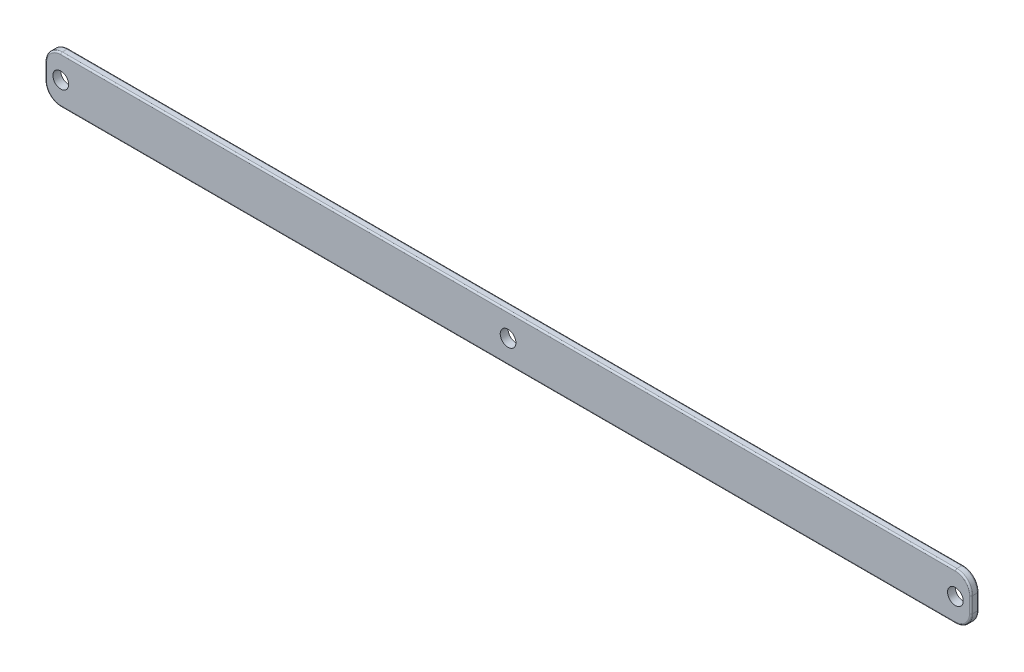
ISO-10303-21;
HEADER;
FILE_DESCRIPTION(('STEP AP214'),'2;1');
FILE_NAME('part.step','',(''),(''),'','','');
FILE_SCHEMA(('AUTOMOTIVE_DESIGN { 1 0 10303 214 1 1 1 1 }'));
ENDSEC;
DATA;
#1=APPLICATION_CONTEXT('core data for automotive mechanical design processes');
#2=APPLICATION_PROTOCOL_DEFINITION('international standard','automotive_design',2000,#1);
#3=PRODUCT_CONTEXT('',#1,'mechanical');
#4=PRODUCT('Part','Part','',(#3));
#5=PRODUCT_RELATED_PRODUCT_CATEGORY('part','',(#4));
#6=PRODUCT_DEFINITION_FORMATION('','',#4);
#7=PRODUCT_DEFINITION_CONTEXT('part definition',#1,'design');
#8=PRODUCT_DEFINITION('design','',#6,#7);
#9=PRODUCT_DEFINITION_SHAPE('','',#8);
#10=(LENGTH_UNIT() NAMED_UNIT(*) SI_UNIT(.MILLI.,.METRE.));
#11=(NAMED_UNIT(*) PLANE_ANGLE_UNIT() SI_UNIT($,.RADIAN.));
#12=(NAMED_UNIT(*) SI_UNIT($,.STERADIAN.) SOLID_ANGLE_UNIT());
#13=UNCERTAINTY_MEASURE_WITH_UNIT(LENGTH_MEASURE(1.E-05),#10,'distance_accuracy_value','');
#14=(GEOMETRIC_REPRESENTATION_CONTEXT(3) GLOBAL_UNCERTAINTY_ASSIGNED_CONTEXT((#13)) GLOBAL_UNIT_ASSIGNED_CONTEXT((#10,
#11,#12)) REPRESENTATION_CONTEXT('',''));
#15=CARTESIAN_POINT('',(0.,0.,0.));
#16=DIRECTION('',(0.,0.,1.));
#17=DIRECTION('',(1.,0.,0.));
#18=AXIS2_PLACEMENT_3D('',#15,#16,#17);
#19=CARTESIAN_POINT('',(0.,0.,5.));
#20=DIRECTION('',(0.,0.,1.));
#21=DIRECTION('',(1.,0.,0.));
#22=AXIS2_PLACEMENT_3D('',#19,#20,#21);
#23=PLANE('',#22);
#24=DIRECTION('',(0.,-1.,0.));
#25=VECTOR('',#24,1.);
#26=CARTESIAN_POINT('',(-288.322395722494,35.1673228346457,5.));
#27=LINE('',#26,#25);
#28=CARTESIAN_POINT('',(-288.322395722494,45.1673228346457,5.));
#29=VERTEX_POINT('',#28);
#30=CARTESIAN_POINT('',(-288.322395722494,35.1673228346457,5.));
#31=VERTEX_POINT('',#30);
#32=EDGE_CURVE('E173',#29,#31,#27,.T.);
#33=ORIENTED_EDGE('',*,*,#32,.T.);
#34=CARTESIAN_POINT('',(-279.322395722494,35.1673228346457,5.));
#35=DIRECTION('',(0.,0.,1.));
#36=DIRECTION('',(1.,0.,0.));
#37=AXIS2_PLACEMENT_3D('',#34,#35,#36);
#38=CIRCLE('',#37,9.);
#39=CARTESIAN_POINT('',(-279.322395722494,26.1673228346457,5.));
#40=VERTEX_POINT('',#39);
#41=EDGE_CURVE('E154',#31,#40,#38,.T.);
#42=ORIENTED_EDGE('',*,*,#41,.T.);
#43=DIRECTION('',(1.,0.,0.));
#44=VECTOR('',#43,1.);
#45=CARTESIAN_POINT('',(290.677604277506,26.1673228346457,5.));
#46=LINE('',#45,#44);
#47=CARTESIAN_POINT('',(290.677604277506,26.1673228346457,5.));
#48=VERTEX_POINT('',#47);
#49=EDGE_CURVE('E162',#40,#48,#46,.T.);
#50=ORIENTED_EDGE('',*,*,#49,.T.);
#51=CARTESIAN_POINT('',(290.677604277506,35.1673228346457,5.));
#52=DIRECTION('',(0.,0.,1.));
#53=DIRECTION('',(1.,0.,0.));
#54=AXIS2_PLACEMENT_3D('',#51,#52,#53);
#55=CIRCLE('',#54,9.);
#56=CARTESIAN_POINT('',(299.677604277506,35.1673228346457,5.));
#57=VERTEX_POINT('',#56);
#58=EDGE_CURVE('E168',#48,#57,#55,.T.);
#59=ORIENTED_EDGE('',*,*,#58,.T.);
#60=DIRECTION('',(0.,1.,0.));
#61=VECTOR('',#60,1.);
#62=CARTESIAN_POINT('',(299.677604277506,45.1673228346457,5.));
#63=LINE('',#62,#61);
#64=CARTESIAN_POINT('',(299.677604277506,45.1673228346457,5.));
#65=VERTEX_POINT('',#64);
#66=EDGE_CURVE('E298',#57,#65,#63,.T.);
#67=ORIENTED_EDGE('',*,*,#66,.T.);
#68=CARTESIAN_POINT('',(290.677604277506,45.1673228346457,5.));
#69=DIRECTION('',(0.,0.,1.));
#70=DIRECTION('',(1.,0.,0.));
#71=AXIS2_PLACEMENT_3D('',#68,#69,#70);
#72=CIRCLE('',#71,9.);
#73=CARTESIAN_POINT('',(290.677604277506,54.1673228346457,5.));
#74=VERTEX_POINT('',#73);
#75=EDGE_CURVE('E300',#65,#74,#72,.T.);
#76=ORIENTED_EDGE('',*,*,#75,.T.);
#77=DIRECTION('',(-1.,0.,0.));
#78=VECTOR('',#77,1.);
#79=CARTESIAN_POINT('',(-279.322395722494,54.1673228346457,5.));
#80=LINE('',#79,#78);
#81=CARTESIAN_POINT('',(-279.322395722494,54.1673228346457,5.));
#82=VERTEX_POINT('',#81);
#83=EDGE_CURVE('E302',#74,#82,#80,.T.);
#84=ORIENTED_EDGE('',*,*,#83,.T.);
#85=CARTESIAN_POINT('',(-279.322395722494,45.1673228346457,5.));
#86=DIRECTION('',(0.,0.,1.));
#87=DIRECTION('',(1.,0.,0.));
#88=AXIS2_PLACEMENT_3D('',#85,#86,#87);
#89=CIRCLE('',#88,9.);
#90=EDGE_CURVE('E179',#82,#29,#89,.T.);
#91=ORIENTED_EDGE('',*,*,#90,.T.);
#92=EDGE_LOOP('',(#33,#42,#50,#59,#67,#76,#84,#91));
#93=FACE_BOUND('',#92,.T.);
#94=CARTESIAN_POINT('',(290.677604277506,40.1673228346457,5.));
#95=DIRECTION('',(0.,0.,1.));
#96=DIRECTION('',(1.,0.,0.));
#97=AXIS2_PLACEMENT_3D('',#94,#95,#96);
#98=CIRCLE('',#97,4.99999999999999);
#99=CARTESIAN_POINT('',(295.677604277506,40.1673228346457,5.));
#100=VERTEX_POINT('',#99);
#101=EDGE_CURVE('E349',#100,#100,#98,.T.);
#102=ORIENTED_EDGE('',*,*,#101,.F.);
#103=EDGE_LOOP('',(#102));
#104=FACE_BOUND('',#103,.T.);
#105=CARTESIAN_POINT('',(-279.322395722494,40.1673228346457,5.));
#106=DIRECTION('',(0.,0.,1.));
#107=DIRECTION('',(1.,0.,0.));
#108=AXIS2_PLACEMENT_3D('',#105,#106,#107);
#109=CIRCLE('',#108,4.99999999999999);
#110=CARTESIAN_POINT('',(-274.322395722494,40.1673228346457,5.));
#111=VERTEX_POINT('',#110);
#112=EDGE_CURVE('E345',#111,#111,#109,.T.);
#113=ORIENTED_EDGE('',*,*,#112,.F.);
#114=EDGE_LOOP('',(#113));
#115=FACE_BOUND('',#114,.T.);
#116=CARTESIAN_POINT('',(5.67760427750585,40.1673228346457,5.));
#117=DIRECTION('',(0.,0.,1.));
#118=DIRECTION('',(1.,0.,0.));
#119=AXIS2_PLACEMENT_3D('',#116,#117,#118);
#120=CIRCLE('',#119,5.);
#121=CARTESIAN_POINT('',(10.6776042775059,40.1673228346457,5.));
#122=VERTEX_POINT('',#121);
#123=EDGE_CURVE('E355',#122,#122,#120,.T.);
#124=ORIENTED_EDGE('',*,*,#123,.F.);
#125=EDGE_LOOP('',(#124));
#126=FACE_BOUND('',#125,.T.);
#127=ADVANCED_FACE('F33',(#93,#104,#115,#126),#23,.T.);
#128=CARTESIAN_POINT('',(0.,0.,0.));
#129=DIRECTION('',(0.,0.,1.));
#130=DIRECTION('',(1.,0.,0.));
#131=AXIS2_PLACEMENT_3D('',#128,#129,#130);
#132=PLANE('',#131);
#133=DIRECTION('',(1.,0.,0.));
#134=VECTOR('',#133,1.);
#135=CARTESIAN_POINT('',(0.,26.1673228346457,0.));
#136=LINE('',#135,#134);
#137=CARTESIAN_POINT('',(290.677604277506,26.1673228346457,0.));
#138=VERTEX_POINT('',#137);
#139=CARTESIAN_POINT('',(-279.322395722494,26.1673228346457,0.));
#140=VERTEX_POINT('',#139);
#141=EDGE_CURVE('E208',#138,#140,#136,.F.);
#142=ORIENTED_EDGE('',*,*,#141,.T.);
#143=CARTESIAN_POINT('',(-279.322395722494,35.1673228346457,0.));
#144=DIRECTION('',(0.,0.,1.));
#145=DIRECTION('',(1.,0.,0.));
#146=AXIS2_PLACEMENT_3D('',#143,#144,#145);
#147=CIRCLE('',#146,9.);
#148=CARTESIAN_POINT('',(-288.322395722494,35.1673228346457,0.));
#149=VERTEX_POINT('',#148);
#150=EDGE_CURVE('E221',#140,#149,#147,.F.);
#151=ORIENTED_EDGE('',*,*,#150,.T.);
#152=DIRECTION('',(0.,-1.,0.));
#153=VECTOR('',#152,1.);
#154=CARTESIAN_POINT('',(-288.322395722494,5.33503603743665E-13,0.));
#155=LINE('',#154,#153);
#156=CARTESIAN_POINT('',(-288.322395722494,45.1673228346457,0.));
#157=VERTEX_POINT('',#156);
#158=EDGE_CURVE('E57',#149,#157,#155,.F.);
#159=ORIENTED_EDGE('',*,*,#158,.T.);
#160=CARTESIAN_POINT('',(-279.322395722494,45.1673228346457,0.));
#161=DIRECTION('',(0.,0.,1.));
#162=DIRECTION('',(1.,0.,0.));
#163=AXIS2_PLACEMENT_3D('',#160,#161,#162);
#164=CIRCLE('',#163,9.);
#165=CARTESIAN_POINT('',(-279.322395722494,54.1673228346457,0.));
#166=VERTEX_POINT('',#165);
#167=EDGE_CURVE('E218',#157,#166,#164,.F.);
#168=ORIENTED_EDGE('',*,*,#167,.T.);
#169=DIRECTION('',(-1.,0.,0.));
#170=VECTOR('',#169,1.);
#171=CARTESIAN_POINT('',(0.,54.1673228346457,0.));
#172=LINE('',#171,#170);
#173=CARTESIAN_POINT('',(290.677604277506,54.1673228346457,0.));
#174=VERTEX_POINT('',#173);
#175=EDGE_CURVE('E216',#166,#174,#172,.F.);
#176=ORIENTED_EDGE('',*,*,#175,.T.);
#177=CARTESIAN_POINT('',(290.677604277506,45.1673228346457,0.));
#178=DIRECTION('',(0.,0.,1.));
#179=DIRECTION('',(1.,0.,0.));
#180=AXIS2_PLACEMENT_3D('',#177,#178,#179);
#181=CIRCLE('',#180,9.);
#182=CARTESIAN_POINT('',(299.677604277506,45.1673228346457,0.));
#183=VERTEX_POINT('',#182);
#184=EDGE_CURVE('E214',#174,#183,#181,.F.);
#185=ORIENTED_EDGE('',*,*,#184,.T.);
#186=DIRECTION('',(0.,1.,0.));
#187=VECTOR('',#186,1.);
#188=CARTESIAN_POINT('',(299.677604277506,0.,0.));
#189=LINE('',#188,#187);
#190=CARTESIAN_POINT('',(299.677604277506,35.1673228346457,0.));
#191=VERTEX_POINT('',#190);
#192=EDGE_CURVE('E212',#183,#191,#189,.F.);
#193=ORIENTED_EDGE('',*,*,#192,.T.);
#194=CARTESIAN_POINT('',(290.677604277506,35.1673228346457,0.));
#195=DIRECTION('',(0.,0.,1.));
#196=DIRECTION('',(1.,0.,0.));
#197=AXIS2_PLACEMENT_3D('',#194,#195,#196);
#198=CIRCLE('',#197,9.);
#199=EDGE_CURVE('E210',#191,#138,#198,.F.);
#200=ORIENTED_EDGE('',*,*,#199,.T.);
#201=EDGE_LOOP('',(#142,#151,#159,#168,#176,#185,#193,#200));
#202=FACE_BOUND('',#201,.T.);
#203=CARTESIAN_POINT('',(-279.322395722494,40.1673228346457,0.));
#204=DIRECTION('',(0.,0.,1.));
#205=DIRECTION('',(1.,0.,0.));
#206=AXIS2_PLACEMENT_3D('',#203,#204,#205);
#207=CIRCLE('',#206,4.99999999999999);
#208=CARTESIAN_POINT('',(-274.322395722494,40.1673228346457,0.));
#209=VERTEX_POINT('',#208);
#210=EDGE_CURVE('E346',#209,#209,#207,.T.);
#211=ORIENTED_EDGE('',*,*,#210,.T.);
#212=EDGE_LOOP('',(#211));
#213=FACE_BOUND('',#212,.T.);
#214=CARTESIAN_POINT('',(290.677604277506,40.1673228346457,0.));
#215=DIRECTION('',(0.,0.,1.));
#216=DIRECTION('',(1.,0.,0.));
#217=AXIS2_PLACEMENT_3D('',#214,#215,#216);
#218=CIRCLE('',#217,4.99999999999999);
#219=CARTESIAN_POINT('',(295.677604277506,40.1673228346457,0.));
#220=VERTEX_POINT('',#219);
#221=EDGE_CURVE('E352',#220,#220,#218,.T.);
#222=ORIENTED_EDGE('',*,*,#221,.T.);
#223=EDGE_LOOP('',(#222));
#224=FACE_BOUND('',#223,.T.);
#225=CARTESIAN_POINT('',(5.67760427750585,40.1673228346457,0.));
#226=DIRECTION('',(0.,0.,1.));
#227=DIRECTION('',(1.,0.,0.));
#228=AXIS2_PLACEMENT_3D('',#225,#226,#227);
#229=CIRCLE('',#228,5.);
#230=CARTESIAN_POINT('',(10.6776042775059,40.1673228346457,0.));
#231=VERTEX_POINT('',#230);
#232=EDGE_CURVE('E241',#231,#231,#229,.T.);
#233=ORIENTED_EDGE('',*,*,#232,.T.);
#234=EDGE_LOOP('',(#233));
#235=FACE_BOUND('',#234,.T.);
#236=ADVANCED_FACE('F326',(#202,#213,#224,#235),#132,.F.);
#237=CARTESIAN_POINT('',(-289.322395722494,55.1673228346457,5.));
#238=DIRECTION('',(1.,0.,0.));
#239=DIRECTION('',(0.,1.,0.));
#240=AXIS2_PLACEMENT_3D('',#237,#238,#239);
#241=PLANE('',#240);
#242=DIRECTION('',(0.,0.,-1.));
#243=VECTOR('',#242,1.);
#244=CARTESIAN_POINT('',(-289.322395722494,35.1673228346457,5.));
#245=LINE('',#244,#243);
#246=CARTESIAN_POINT('',(-289.322395722494,35.1673228346457,1.));
#247=VERTEX_POINT('',#246);
#248=CARTESIAN_POINT('',(-289.322395722494,35.1673228346457,4.));
#249=VERTEX_POINT('',#248);
#250=EDGE_CURVE('E169',#247,#249,#245,.F.);
#251=ORIENTED_EDGE('',*,*,#250,.T.);
#252=DIRECTION('',(0.,-1.,0.));
#253=VECTOR('',#252,1.);
#254=CARTESIAN_POINT('',(-289.322395722494,45.1673228346457,4.));
#255=LINE('',#254,#253);
#256=CARTESIAN_POINT('',(-289.322395722494,45.1673228346457,4.));
#257=VERTEX_POINT('',#256);
#258=EDGE_CURVE('E186',#249,#257,#255,.F.);
#259=ORIENTED_EDGE('',*,*,#258,.T.);
#260=DIRECTION('',(0.,0.,-1.));
#261=VECTOR('',#260,1.);
#262=CARTESIAN_POINT('',(-289.322395722494,45.1673228346457,5.));
#263=LINE('',#262,#261);
#264=CARTESIAN_POINT('',(-289.322395722494,45.1673228346457,1.));
#265=VERTEX_POINT('',#264);
#266=EDGE_CURVE('E286',#257,#265,#263,.T.);
#267=ORIENTED_EDGE('',*,*,#266,.T.);
#268=DIRECTION('',(0.,-1.,0.));
#269=VECTOR('',#268,1.);
#270=CARTESIAN_POINT('',(-289.322395722494,55.1673228346457,1.));
#271=LINE('',#270,#269);
#272=EDGE_CURVE('E184',#265,#247,#271,.T.);
#273=ORIENTED_EDGE('',*,*,#272,.T.);
#274=EDGE_LOOP('',(#251,#259,#267,#273));
#275=FACE_BOUND('',#274,.T.);
#276=ADVANCED_FACE('F321',(#275),#241,.F.);
#277=CARTESIAN_POINT('',(-289.322395722494,25.1673228346457,5.));
#278=DIRECTION('',(0.,1.,0.));
#279=DIRECTION('',(0.,0.,1.));
#280=AXIS2_PLACEMENT_3D('',#277,#278,#279);
#281=PLANE('',#280);
#282=DIRECTION('',(0.,0.,-1.));
#283=VECTOR('',#282,1.);
#284=CARTESIAN_POINT('',(290.677604277506,25.1673228346457,5.));
#285=LINE('',#284,#283);
#286=CARTESIAN_POINT('',(290.677604277506,25.1673228346457,1.));
#287=VERTEX_POINT('',#286);
#288=CARTESIAN_POINT('',(290.677604277506,25.1673228346457,4.));
#289=VERTEX_POINT('',#288);
#290=EDGE_CURVE('E291',#287,#289,#285,.F.);
#291=ORIENTED_EDGE('',*,*,#290,.T.);
#292=DIRECTION('',(1.,0.,0.));
#293=VECTOR('',#292,1.);
#294=CARTESIAN_POINT('',(-279.322395722494,25.1673228346457,4.));
#295=LINE('',#294,#293);
#296=CARTESIAN_POINT('',(-279.322395722494,25.1673228346457,4.));
#297=VERTEX_POINT('',#296);
#298=EDGE_CURVE('E11',#289,#297,#295,.F.);
#299=ORIENTED_EDGE('',*,*,#298,.T.);
#300=DIRECTION('',(0.,0.,-1.));
#301=VECTOR('',#300,1.);
#302=CARTESIAN_POINT('',(-279.322395722494,25.1673228346457,5.));
#303=LINE('',#302,#301);
#304=CARTESIAN_POINT('',(-279.322395722494,25.1673228346457,1.));
#305=VERTEX_POINT('',#304);
#306=EDGE_CURVE('E320',#297,#305,#303,.T.);
#307=ORIENTED_EDGE('',*,*,#306,.T.);
#308=DIRECTION('',(1.,0.,0.));
#309=VECTOR('',#308,1.);
#310=CARTESIAN_POINT('',(-289.322395722494,25.1673228346457,1.));
#311=LINE('',#310,#309);
#312=EDGE_CURVE('E42',#305,#287,#311,.T.);
#313=ORIENTED_EDGE('',*,*,#312,.T.);
#314=EDGE_LOOP('',(#291,#299,#307,#313));
#315=FACE_BOUND('',#314,.T.);
#316=ADVANCED_FACE('F338',(#315),#281,.F.);
#317=CARTESIAN_POINT('',(300.677604277506,55.1673228346457,5.));
#318=DIRECTION('',(-1.,0.,0.));
#319=DIRECTION('',(0.,0.,1.));
#320=AXIS2_PLACEMENT_3D('',#317,#318,#319);
#321=PLANE('',#320);
#322=DIRECTION('',(0.,0.,-1.));
#323=VECTOR('',#322,1.);
#324=CARTESIAN_POINT('',(300.677604277506,45.1673228346457,5.));
#325=LINE('',#324,#323);
#326=CARTESIAN_POINT('',(300.677604277506,45.1673228346457,1.));
#327=VERTEX_POINT('',#326);
#328=CARTESIAN_POINT('',(300.677604277506,45.1673228346457,4.));
#329=VERTEX_POINT('',#328);
#330=EDGE_CURVE('E280',#327,#329,#325,.F.);
#331=ORIENTED_EDGE('',*,*,#330,.T.);
#332=DIRECTION('',(0.,1.,0.));
#333=VECTOR('',#332,1.);
#334=CARTESIAN_POINT('',(300.677604277506,35.1673228346457,4.));
#335=LINE('',#334,#333);
#336=CARTESIAN_POINT('',(300.677604277506,35.1673228346457,4.));
#337=VERTEX_POINT('',#336);
#338=EDGE_CURVE('E202',#329,#337,#335,.F.);
#339=ORIENTED_EDGE('',*,*,#338,.T.);
#340=DIRECTION('',(0.,0.,-1.));
#341=VECTOR('',#340,1.);
#342=CARTESIAN_POINT('',(300.677604277506,35.1673228346457,5.));
#343=LINE('',#342,#341);
#344=CARTESIAN_POINT('',(300.677604277506,35.1673228346457,1.));
#345=VERTEX_POINT('',#344);
#346=EDGE_CURVE('E339',#337,#345,#343,.T.);
#347=ORIENTED_EDGE('',*,*,#346,.T.);
#348=DIRECTION('',(0.,1.,0.));
#349=VECTOR('',#348,1.);
#350=CARTESIAN_POINT('',(300.677604277506,55.1673228346457,1.));
#351=LINE('',#350,#349);
#352=EDGE_CURVE('E200',#345,#327,#351,.T.);
#353=ORIENTED_EDGE('',*,*,#352,.T.);
#354=EDGE_LOOP('',(#331,#339,#347,#353));
#355=FACE_BOUND('',#354,.T.);
#356=ADVANCED_FACE('F378',(#355),#321,.F.);
#357=CARTESIAN_POINT('',(-289.322395722494,55.1673228346457,5.));
#358=DIRECTION('',(0.,-1.,0.));
#359=DIRECTION('',(0.,0.,-1.));
#360=AXIS2_PLACEMENT_3D('',#357,#358,#359);
#361=PLANE('',#360);
#362=DIRECTION('',(0.,0.,-1.));
#363=VECTOR('',#362,1.);
#364=CARTESIAN_POINT('',(-279.322395722494,55.1673228346457,5.));
#365=LINE('',#364,#363);
#366=CARTESIAN_POINT('',(-279.322395722494,55.1673228346457,1.));
#367=VERTEX_POINT('',#366);
#368=CARTESIAN_POINT('',(-279.322395722494,55.1673228346457,4.));
#369=VERTEX_POINT('',#368);
#370=EDGE_CURVE('E287',#367,#369,#365,.F.);
#371=ORIENTED_EDGE('',*,*,#370,.T.);
#372=DIRECTION('',(-1.,0.,0.));
#373=VECTOR('',#372,1.);
#374=CARTESIAN_POINT('',(290.677604277506,55.1673228346457,4.));
#375=LINE('',#374,#373);
#376=CARTESIAN_POINT('',(290.677604277506,55.1673228346457,4.));
#377=VERTEX_POINT('',#376);
#378=EDGE_CURVE('E194',#369,#377,#375,.F.);
#379=ORIENTED_EDGE('',*,*,#378,.T.);
#380=DIRECTION('',(0.,0.,-1.));
#381=VECTOR('',#380,1.);
#382=CARTESIAN_POINT('',(290.677604277506,55.1673228346457,5.));
#383=LINE('',#382,#381);
#384=CARTESIAN_POINT('',(290.677604277506,55.1673228346457,1.));
#385=VERTEX_POINT('',#384);
#386=EDGE_CURVE('E277',#377,#385,#383,.T.);
#387=ORIENTED_EDGE('',*,*,#386,.T.);
#388=DIRECTION('',(-1.,0.,0.));
#389=VECTOR('',#388,1.);
#390=CARTESIAN_POINT('',(-289.322395722494,55.1673228346457,1.));
#391=LINE('',#390,#389);
#392=EDGE_CURVE('E192',#385,#367,#391,.T.);
#393=ORIENTED_EDGE('',*,*,#392,.T.);
#394=EDGE_LOOP('',(#371,#379,#387,#393));
#395=FACE_BOUND('',#394,.T.);
#396=ADVANCED_FACE('F283',(#395),#361,.F.);
#397=CARTESIAN_POINT('',(-279.322395722494,40.1673228346457,5.));
#398=DIRECTION('',(0.,0.,-1.));
#399=DIRECTION('',(-1.,0.,0.));
#400=AXIS2_PLACEMENT_3D('',#397,#398,#399);
#401=CYLINDRICAL_SURFACE('',#400,4.99999999999999);
#402=ORIENTED_EDGE('',*,*,#112,.T.);
#403=EDGE_LOOP('',(#402));
#404=FACE_BOUND('',#403,.T.);
#405=ORIENTED_EDGE('',*,*,#210,.F.);
#406=EDGE_LOOP('',(#405));
#407=FACE_BOUND('',#406,.T.);
#408=ADVANCED_FACE('F373',(#404,#407),#401,.F.);
#409=CARTESIAN_POINT('',(290.677604277506,40.1673228346457,5.));
#410=DIRECTION('',(0.,0.,-1.));
#411=DIRECTION('',(-1.,0.,0.));
#412=AXIS2_PLACEMENT_3D('',#409,#410,#411);
#413=CYLINDRICAL_SURFACE('',#412,4.99999999999999);
#414=ORIENTED_EDGE('',*,*,#101,.T.);
#415=EDGE_LOOP('',(#414));
#416=FACE_BOUND('',#415,.T.);
#417=ORIENTED_EDGE('',*,*,#221,.F.);
#418=EDGE_LOOP('',(#417));
#419=FACE_BOUND('',#418,.T.);
#420=ADVANCED_FACE('F499',(#416,#419),#413,.F.);
#421=CARTESIAN_POINT('',(5.67760427750585,40.1673228346457,5.));
#422=DIRECTION('',(0.,0.,-1.));
#423=DIRECTION('',(-1.,0.,0.));
#424=AXIS2_PLACEMENT_3D('',#421,#422,#423);
#425=CYLINDRICAL_SURFACE('',#424,5.);
#426=ORIENTED_EDGE('',*,*,#123,.T.);
#427=EDGE_LOOP('',(#426));
#428=FACE_BOUND('',#427,.T.);
#429=ORIENTED_EDGE('',*,*,#232,.F.);
#430=EDGE_LOOP('',(#429));
#431=FACE_BOUND('',#430,.T.);
#432=ADVANCED_FACE('F363',(#428,#431),#425,.F.);
#433=CARTESIAN_POINT('',(290.677604277506,35.1673228346457,5.));
#434=DIRECTION('',(0.,0.,-1.));
#435=DIRECTION('',(-1.,0.,0.));
#436=AXIS2_PLACEMENT_3D('',#433,#434,#435);
#437=CYLINDRICAL_SURFACE('',#436,10.);
#438=ORIENTED_EDGE('',*,*,#346,.F.);
#439=CARTESIAN_POINT('',(290.677604277506,35.1673228346457,4.));
#440=DIRECTION('',(0.,0.,1.));
#441=DIRECTION('',(1.,0.,0.));
#442=AXIS2_PLACEMENT_3D('',#439,#440,#441);
#443=CIRCLE('',#442,10.);
#444=EDGE_CURVE('E206',#337,#289,#443,.F.);
#445=ORIENTED_EDGE('',*,*,#444,.T.);
#446=ORIENTED_EDGE('',*,*,#290,.F.);
#447=CARTESIAN_POINT('',(290.677604277506,35.1673228346457,1.));
#448=DIRECTION('',(0.,0.,1.));
#449=DIRECTION('',(1.,0.,0.));
#450=AXIS2_PLACEMENT_3D('',#447,#448,#449);
#451=CIRCLE('',#450,10.);
#452=EDGE_CURVE('E204',#287,#345,#451,.T.);
#453=ORIENTED_EDGE('',*,*,#452,.T.);
#454=EDGE_LOOP('',(#438,#445,#446,#453));
#455=FACE_BOUND('',#454,.T.);
#456=ADVANCED_FACE('F386',(#455),#437,.T.);
#457=CARTESIAN_POINT('',(290.677604277506,45.1673228346457,5.));
#458=DIRECTION('',(0.,0.,-1.));
#459=DIRECTION('',(-1.,0.,0.));
#460=AXIS2_PLACEMENT_3D('',#457,#458,#459);
#461=CYLINDRICAL_SURFACE('',#460,10.);
#462=ORIENTED_EDGE('',*,*,#386,.F.);
#463=CARTESIAN_POINT('',(290.677604277506,45.1673228346457,4.));
#464=DIRECTION('',(0.,0.,1.));
#465=DIRECTION('',(1.,0.,0.));
#466=AXIS2_PLACEMENT_3D('',#463,#464,#465);
#467=CIRCLE('',#466,10.);
#468=EDGE_CURVE('E198',#377,#329,#467,.F.);
#469=ORIENTED_EDGE('',*,*,#468,.T.);
#470=ORIENTED_EDGE('',*,*,#330,.F.);
#471=CARTESIAN_POINT('',(290.677604277506,45.1673228346457,1.));
#472=DIRECTION('',(0.,0.,1.));
#473=DIRECTION('',(1.,0.,0.));
#474=AXIS2_PLACEMENT_3D('',#471,#472,#473);
#475=CIRCLE('',#474,10.);
#476=EDGE_CURVE('E196',#327,#385,#475,.T.);
#477=ORIENTED_EDGE('',*,*,#476,.T.);
#478=EDGE_LOOP('',(#462,#469,#470,#477));
#479=FACE_BOUND('',#478,.T.);
#480=ADVANCED_FACE('F276',(#479),#461,.T.);
#481=CARTESIAN_POINT('',(-279.322395722494,35.1673228346457,5.));
#482=DIRECTION('',(0.,0.,-1.));
#483=DIRECTION('',(-1.,0.,0.));
#484=AXIS2_PLACEMENT_3D('',#481,#482,#483);
#485=CYLINDRICAL_SURFACE('',#484,10.);
#486=ORIENTED_EDGE('',*,*,#306,.F.);
#487=CARTESIAN_POINT('',(-279.322395722494,35.1673228346457,4.));
#488=DIRECTION('',(0.,0.,1.));
#489=DIRECTION('',(1.,0.,0.));
#490=AXIS2_PLACEMENT_3D('',#487,#488,#489);
#491=CIRCLE('',#490,10.);
#492=EDGE_CURVE('E156',#297,#249,#491,.F.);
#493=ORIENTED_EDGE('',*,*,#492,.T.);
#494=ORIENTED_EDGE('',*,*,#250,.F.);
#495=CARTESIAN_POINT('',(-279.322395722494,35.1673228346457,1.));
#496=DIRECTION('',(0.,0.,1.));
#497=DIRECTION('',(1.,0.,0.));
#498=AXIS2_PLACEMENT_3D('',#495,#496,#497);
#499=CIRCLE('',#498,10.);
#500=EDGE_CURVE('E175',#247,#305,#499,.T.);
#501=ORIENTED_EDGE('',*,*,#500,.T.);
#502=EDGE_LOOP('',(#486,#493,#494,#501));
#503=FACE_BOUND('',#502,.T.);
#504=ADVANCED_FACE('F318',(#503),#485,.T.);
#505=CARTESIAN_POINT('',(-279.322395722494,45.1673228346457,5.));
#506=DIRECTION('',(0.,0.,-1.));
#507=DIRECTION('',(-1.,0.,0.));
#508=AXIS2_PLACEMENT_3D('',#505,#506,#507);
#509=CYLINDRICAL_SURFACE('',#508,10.);
#510=ORIENTED_EDGE('',*,*,#266,.F.);
#511=CARTESIAN_POINT('',(-279.322395722494,45.1673228346457,4.));
#512=DIRECTION('',(0.,0.,1.));
#513=DIRECTION('',(1.,0.,0.));
#514=AXIS2_PLACEMENT_3D('',#511,#512,#513);
#515=CIRCLE('',#514,10.);
#516=EDGE_CURVE('E190',#257,#369,#515,.F.);
#517=ORIENTED_EDGE('',*,*,#516,.T.);
#518=ORIENTED_EDGE('',*,*,#370,.F.);
#519=CARTESIAN_POINT('',(-279.322395722494,45.1673228346457,1.));
#520=DIRECTION('',(0.,0.,1.));
#521=DIRECTION('',(1.,0.,0.));
#522=AXIS2_PLACEMENT_3D('',#519,#520,#521);
#523=CIRCLE('',#522,10.);
#524=EDGE_CURVE('E188',#367,#265,#523,.T.);
#525=ORIENTED_EDGE('',*,*,#524,.T.);
#526=EDGE_LOOP('',(#510,#517,#518,#525));
#527=FACE_BOUND('',#526,.T.);
#528=ADVANCED_FACE('F394',(#527),#509,.T.);
#529=CARTESIAN_POINT('',(290.677604277506,45.1673228346457,4.));
#530=DIRECTION('',(0.,0.,1.));
#531=DIRECTION('',(1.,0.,0.));
#532=AXIS2_PLACEMENT_3D('',#529,#530,#531);
#533=TOROIDAL_SURFACE('',#532,9.,1.);
#534=CARTESIAN_POINT('',(299.677604277506,45.1673228346457,4.));
#535=DIRECTION('',(0.,-1.,0.));
#536=DIRECTION('',(0.,0.,-1.));
#537=AXIS2_PLACEMENT_3D('',#534,#535,#536);
#538=CIRCLE('',#537,1.);
#539=EDGE_CURVE('E235',#329,#65,#538,.T.);
#540=ORIENTED_EDGE('',*,*,#539,.F.);
#541=ORIENTED_EDGE('',*,*,#468,.F.);
#542=CARTESIAN_POINT('',(290.677604277506,54.1673228346457,4.));
#543=DIRECTION('',(-1.,0.,0.));
#544=DIRECTION('',(0.,0.,1.));
#545=AXIS2_PLACEMENT_3D('',#542,#543,#544);
#546=CIRCLE('',#545,1.);
#547=EDGE_CURVE('E238',#74,#377,#546,.T.);
#548=ORIENTED_EDGE('',*,*,#547,.F.);
#549=ORIENTED_EDGE('',*,*,#75,.F.);
#550=EDGE_LOOP('',(#540,#541,#548,#549));
#551=FACE_BOUND('',#550,.T.);
#552=ADVANCED_FACE('F397',(#551),#533,.T.);
#553=CARTESIAN_POINT('',(0.,54.1673228346457,4.));
#554=DIRECTION('',(1.,0.,0.));
#555=DIRECTION('',(0.,0.,-1.));
#556=AXIS2_PLACEMENT_3D('',#553,#554,#555);
#557=CYLINDRICAL_SURFACE('',#556,1.);
#558=ORIENTED_EDGE('',*,*,#547,.T.);
#559=ORIENTED_EDGE('',*,*,#378,.F.);
#560=CARTESIAN_POINT('',(-279.322395722494,54.1673228346457,4.));
#561=DIRECTION('',(-1.,0.,0.));
#562=DIRECTION('',(0.,0.,1.));
#563=AXIS2_PLACEMENT_3D('',#560,#561,#562);
#564=CIRCLE('',#563,1.);
#565=EDGE_CURVE('E232',#82,#369,#564,.T.);
#566=ORIENTED_EDGE('',*,*,#565,.F.);
#567=ORIENTED_EDGE('',*,*,#83,.F.);
#568=EDGE_LOOP('',(#558,#559,#566,#567));
#569=FACE_BOUND('',#568,.T.);
#570=ADVANCED_FACE('F414',(#569),#557,.T.);
#571=CARTESIAN_POINT('',(299.677604277506,0.,4.));
#572=DIRECTION('',(0.,-1.,0.));
#573=DIRECTION('',(0.,0.,-1.));
#574=AXIS2_PLACEMENT_3D('',#571,#572,#573);
#575=CYLINDRICAL_SURFACE('',#574,1.);
#576=ORIENTED_EDGE('',*,*,#539,.T.);
#577=ORIENTED_EDGE('',*,*,#66,.F.);
#578=CARTESIAN_POINT('',(299.677604277506,35.1673228346457,4.));
#579=DIRECTION('',(0.,-1.,0.));
#580=DIRECTION('',(0.,0.,-1.));
#581=AXIS2_PLACEMENT_3D('',#578,#579,#580);
#582=CIRCLE('',#581,1.);
#583=EDGE_CURVE('E229',#337,#57,#582,.T.);
#584=ORIENTED_EDGE('',*,*,#583,.F.);
#585=ORIENTED_EDGE('',*,*,#338,.F.);
#586=EDGE_LOOP('',(#576,#577,#584,#585));
#587=FACE_BOUND('',#586,.T.);
#588=ADVANCED_FACE('F411',(#587),#575,.T.);
#589=CARTESIAN_POINT('',(-279.322395722494,45.1673228346457,4.));
#590=DIRECTION('',(0.,0.,1.));
#591=DIRECTION('',(1.,0.,0.));
#592=AXIS2_PLACEMENT_3D('',#589,#590,#591);
#593=TOROIDAL_SURFACE('',#592,9.,1.);
#594=ORIENTED_EDGE('',*,*,#565,.T.);
#595=ORIENTED_EDGE('',*,*,#516,.F.);
#596=CARTESIAN_POINT('',(-288.322395722494,45.1673228346457,4.));
#597=DIRECTION('',(0.,-1.,0.));
#598=DIRECTION('',(0.,0.,-1.));
#599=AXIS2_PLACEMENT_3D('',#596,#597,#598);
#600=CIRCLE('',#599,1.);
#601=EDGE_CURVE('E226',#29,#257,#600,.T.);
#602=ORIENTED_EDGE('',*,*,#601,.F.);
#603=ORIENTED_EDGE('',*,*,#90,.F.);
#604=EDGE_LOOP('',(#594,#595,#602,#603));
#605=FACE_BOUND('',#604,.T.);
#606=ADVANCED_FACE('F309',(#605),#593,.T.);
#607=CARTESIAN_POINT('',(290.677604277506,35.1673228346457,4.));
#608=DIRECTION('',(0.,0.,1.));
#609=DIRECTION('',(1.,0.,0.));
#610=AXIS2_PLACEMENT_3D('',#607,#608,#609);
#611=TOROIDAL_SURFACE('',#610,9.,1.);
#612=ORIENTED_EDGE('',*,*,#583,.T.);
#613=ORIENTED_EDGE('',*,*,#58,.F.);
#614=CARTESIAN_POINT('',(290.677604277506,26.1673228346457,4.));
#615=DIRECTION('',(-1.,0.,0.));
#616=DIRECTION('',(0.,0.,1.));
#617=AXIS2_PLACEMENT_3D('',#614,#615,#616);
#618=CIRCLE('',#617,1.);
#619=EDGE_CURVE('E165',#289,#48,#618,.T.);
#620=ORIENTED_EDGE('',*,*,#619,.F.);
#621=ORIENTED_EDGE('',*,*,#444,.F.);
#622=EDGE_LOOP('',(#612,#613,#620,#621));
#623=FACE_BOUND('',#622,.T.);
#624=ADVANCED_FACE('F405',(#623),#611,.T.);
#625=CARTESIAN_POINT('',(-288.322395722494,5.33503603743665E-13,4.));
#626=DIRECTION('',(0.,1.,0.));
#627=DIRECTION('',(-1.,0.,0.));
#628=AXIS2_PLACEMENT_3D('',#625,#626,#627);
#629=CYLINDRICAL_SURFACE('',#628,1.);
#630=ORIENTED_EDGE('',*,*,#601,.T.);
#631=ORIENTED_EDGE('',*,*,#258,.F.);
#632=CARTESIAN_POINT('',(-288.322395722494,35.1673228346457,4.));
#633=DIRECTION('',(0.,-1.,0.));
#634=DIRECTION('',(0.,0.,-1.));
#635=AXIS2_PLACEMENT_3D('',#632,#633,#634);
#636=CIRCLE('',#635,1.);
#637=EDGE_CURVE('E159',#31,#249,#636,.T.);
#638=ORIENTED_EDGE('',*,*,#637,.F.);
#639=ORIENTED_EDGE('',*,*,#32,.F.);
#640=EDGE_LOOP('',(#630,#631,#638,#639));
#641=FACE_BOUND('',#640,.T.);
#642=ADVANCED_FACE('F312',(#641),#629,.T.);
#643=CARTESIAN_POINT('',(0.,26.1673228346457,4.));
#644=DIRECTION('',(-1.,0.,0.));
#645=DIRECTION('',(0.,0.,1.));
#646=AXIS2_PLACEMENT_3D('',#643,#644,#645);
#647=CYLINDRICAL_SURFACE('',#646,1.);
#648=ORIENTED_EDGE('',*,*,#619,.T.);
#649=ORIENTED_EDGE('',*,*,#49,.F.);
#650=CARTESIAN_POINT('',(-279.322395722494,26.1673228346457,4.));
#651=DIRECTION('',(-1.,0.,0.));
#652=DIRECTION('',(0.,0.,1.));
#653=AXIS2_PLACEMENT_3D('',#650,#651,#652);
#654=CIRCLE('',#653,1.);
#655=EDGE_CURVE('E150',#297,#40,#654,.T.);
#656=ORIENTED_EDGE('',*,*,#655,.F.);
#657=ORIENTED_EDGE('',*,*,#298,.F.);
#658=EDGE_LOOP('',(#648,#649,#656,#657));
#659=FACE_BOUND('',#658,.T.);
#660=ADVANCED_FACE('F163',(#659),#647,.T.);
#661=CARTESIAN_POINT('',(-279.322395722494,35.1673228346457,4.));
#662=DIRECTION('',(0.,0.,1.));
#663=DIRECTION('',(1.,0.,0.));
#664=AXIS2_PLACEMENT_3D('',#661,#662,#663);
#665=TOROIDAL_SURFACE('',#664,9.,1.);
#666=ORIENTED_EDGE('',*,*,#637,.T.);
#667=ORIENTED_EDGE('',*,*,#492,.F.);
#668=ORIENTED_EDGE('',*,*,#655,.T.);
#669=ORIENTED_EDGE('',*,*,#41,.F.);
#670=EDGE_LOOP('',(#666,#667,#668,#669));
#671=FACE_BOUND('',#670,.T.);
#672=ADVANCED_FACE('F152',(#671),#665,.T.);
#673=CARTESIAN_POINT('',(290.677604277506,45.1673228346457,1.));
#674=DIRECTION('',(0.,0.,1.));
#675=DIRECTION('',(1.,0.,0.));
#676=AXIS2_PLACEMENT_3D('',#673,#674,#675);
#677=TOROIDAL_SURFACE('',#676,9.,1.);
#678=CARTESIAN_POINT('',(290.677604277506,54.1673228346457,1.));
#679=DIRECTION('',(-1.,0.,0.));
#680=DIRECTION('',(0.,0.,1.));
#681=AXIS2_PLACEMENT_3D('',#678,#679,#680);
#682=CIRCLE('',#681,1.);
#683=EDGE_CURVE('E256',#385,#174,#682,.T.);
#684=ORIENTED_EDGE('',*,*,#683,.F.);
#685=ORIENTED_EDGE('',*,*,#476,.F.);
#686=CARTESIAN_POINT('',(299.677604277506,45.1673228346457,1.));
#687=DIRECTION('',(0.,-1.,0.));
#688=DIRECTION('',(0.,0.,-1.));
#689=AXIS2_PLACEMENT_3D('',#686,#687,#688);
#690=CIRCLE('',#689,1.);
#691=EDGE_CURVE('E37',#183,#327,#690,.T.);
#692=ORIENTED_EDGE('',*,*,#691,.F.);
#693=ORIENTED_EDGE('',*,*,#184,.F.);
#694=EDGE_LOOP('',(#684,#685,#692,#693));
#695=FACE_BOUND('',#694,.T.);
#696=ADVANCED_FACE('F35',(#695),#677,.T.);
#697=CARTESIAN_POINT('',(299.677604277506,55.1673228346457,1.));
#698=DIRECTION('',(0.,1.,0.));
#699=DIRECTION('',(0.,0.,1.));
#700=AXIS2_PLACEMENT_3D('',#697,#698,#699);
#701=CYLINDRICAL_SURFACE('',#700,1.);
#702=ORIENTED_EDGE('',*,*,#691,.T.);
#703=ORIENTED_EDGE('',*,*,#352,.F.);
#704=CARTESIAN_POINT('',(299.677604277506,35.1673228346457,1.));
#705=DIRECTION('',(0.,-1.,0.));
#706=DIRECTION('',(0.,0.,-1.));
#707=AXIS2_PLACEMENT_3D('',#704,#705,#706);
#708=CIRCLE('',#707,1.);
#709=EDGE_CURVE('E254',#191,#345,#708,.T.);
#710=ORIENTED_EDGE('',*,*,#709,.F.);
#711=ORIENTED_EDGE('',*,*,#192,.F.);
#712=EDGE_LOOP('',(#702,#703,#710,#711));
#713=FACE_BOUND('',#712,.T.);
#714=ADVANCED_FACE('F267',(#713),#701,.T.);
#715=CARTESIAN_POINT('',(-289.322395722494,54.1673228346457,1.));
#716=DIRECTION('',(-1.,0.,0.));
#717=DIRECTION('',(0.,0.,1.));
#718=AXIS2_PLACEMENT_3D('',#715,#716,#717);
#719=CYLINDRICAL_SURFACE('',#718,1.);
#720=ORIENTED_EDGE('',*,*,#683,.T.);
#721=ORIENTED_EDGE('',*,*,#175,.F.);
#722=CARTESIAN_POINT('',(-279.322395722494,54.1673228346457,1.));
#723=DIRECTION('',(-1.,0.,0.));
#724=DIRECTION('',(0.,0.,1.));
#725=AXIS2_PLACEMENT_3D('',#722,#723,#724);
#726=CIRCLE('',#725,1.);
#727=EDGE_CURVE('E251',#367,#166,#726,.T.);
#728=ORIENTED_EDGE('',*,*,#727,.F.);
#729=ORIENTED_EDGE('',*,*,#392,.F.);
#730=EDGE_LOOP('',(#720,#721,#728,#729));
#731=FACE_BOUND('',#730,.T.);
#732=ADVANCED_FACE('F435',(#731),#719,.T.);
#733=CARTESIAN_POINT('',(290.677604277506,35.1673228346457,1.));
#734=DIRECTION('',(0.,0.,1.));
#735=DIRECTION('',(1.,0.,0.));
#736=AXIS2_PLACEMENT_3D('',#733,#734,#735);
#737=TOROIDAL_SURFACE('',#736,9.,1.);
#738=ORIENTED_EDGE('',*,*,#709,.T.);
#739=ORIENTED_EDGE('',*,*,#452,.F.);
#740=CARTESIAN_POINT('',(290.677604277506,26.1673228346457,1.));
#741=DIRECTION('',(-1.,0.,0.));
#742=DIRECTION('',(0.,0.,1.));
#743=AXIS2_PLACEMENT_3D('',#740,#741,#742);
#744=CIRCLE('',#743,1.);
#745=EDGE_CURVE('E248',#138,#287,#744,.T.);
#746=ORIENTED_EDGE('',*,*,#745,.F.);
#747=ORIENTED_EDGE('',*,*,#199,.F.);
#748=EDGE_LOOP('',(#738,#739,#746,#747));
#749=FACE_BOUND('',#748,.T.);
#750=ADVANCED_FACE('F431',(#749),#737,.T.);
#751=CARTESIAN_POINT('',(-279.322395722494,45.1673228346457,1.));
#752=DIRECTION('',(0.,0.,1.));
#753=DIRECTION('',(1.,0.,0.));
#754=AXIS2_PLACEMENT_3D('',#751,#752,#753);
#755=TOROIDAL_SURFACE('',#754,9.,1.);
#756=ORIENTED_EDGE('',*,*,#727,.T.);
#757=ORIENTED_EDGE('',*,*,#167,.F.);
#758=CARTESIAN_POINT('',(-288.322395722494,45.1673228346457,1.));
#759=DIRECTION('',(0.,-1.,0.));
#760=DIRECTION('',(0.,0.,-1.));
#761=AXIS2_PLACEMENT_3D('',#758,#759,#760);
#762=CIRCLE('',#761,1.);
#763=EDGE_CURVE('E245',#265,#157,#762,.T.);
#764=ORIENTED_EDGE('',*,*,#763,.F.);
#765=ORIENTED_EDGE('',*,*,#524,.F.);
#766=EDGE_LOOP('',(#756,#757,#764,#765));
#767=FACE_BOUND('',#766,.T.);
#768=ADVANCED_FACE('F428',(#767),#755,.T.);
#769=CARTESIAN_POINT('',(-289.322395722494,26.1673228346457,1.));
#770=DIRECTION('',(1.,0.,0.));
#771=DIRECTION('',(0.,0.,-1.));
#772=AXIS2_PLACEMENT_3D('',#769,#770,#771);
#773=CYLINDRICAL_SURFACE('',#772,1.);
#774=ORIENTED_EDGE('',*,*,#745,.T.);
#775=ORIENTED_EDGE('',*,*,#312,.F.);
#776=CARTESIAN_POINT('',(-279.322395722494,26.1673228346457,1.));
#777=DIRECTION('',(-1.,0.,0.));
#778=DIRECTION('',(0.,0.,1.));
#779=AXIS2_PLACEMENT_3D('',#776,#777,#778);
#780=CIRCLE('',#779,1.);
#781=EDGE_CURVE('E243',#140,#305,#780,.T.);
#782=ORIENTED_EDGE('',*,*,#781,.F.);
#783=ORIENTED_EDGE('',*,*,#141,.F.);
#784=EDGE_LOOP('',(#774,#775,#782,#783));
#785=FACE_BOUND('',#784,.T.);
#786=ADVANCED_FACE('F333',(#785),#773,.T.);
#787=CARTESIAN_POINT('',(-288.322395722494,55.1673228346457,1.));
#788=DIRECTION('',(0.,-1.,0.));
#789=DIRECTION('',(1.,0.,0.));
#790=AXIS2_PLACEMENT_3D('',#787,#788,#789);
#791=CYLINDRICAL_SURFACE('',#790,1.);
#792=ORIENTED_EDGE('',*,*,#763,.T.);
#793=ORIENTED_EDGE('',*,*,#158,.F.);
#794=CARTESIAN_POINT('',(-288.322395722494,35.1673228346457,1.));
#795=DIRECTION('',(0.,-1.,0.));
#796=DIRECTION('',(0.,0.,-1.));
#797=AXIS2_PLACEMENT_3D('',#794,#795,#796);
#798=CIRCLE('',#797,1.);
#799=EDGE_CURVE('E50',#247,#149,#798,.T.);
#800=ORIENTED_EDGE('',*,*,#799,.F.);
#801=ORIENTED_EDGE('',*,*,#272,.F.);
#802=EDGE_LOOP('',(#792,#793,#800,#801));
#803=FACE_BOUND('',#802,.T.);
#804=ADVANCED_FACE('F325',(#803),#791,.T.);
#805=CARTESIAN_POINT('',(-279.322395722494,35.1673228346457,1.));
#806=DIRECTION('',(0.,0.,1.));
#807=DIRECTION('',(1.,0.,0.));
#808=AXIS2_PLACEMENT_3D('',#805,#806,#807);
#809=TOROIDAL_SURFACE('',#808,9.,1.);
#810=ORIENTED_EDGE('',*,*,#781,.T.);
#811=ORIENTED_EDGE('',*,*,#500,.F.);
#812=ORIENTED_EDGE('',*,*,#799,.T.);
#813=ORIENTED_EDGE('',*,*,#150,.F.);
#814=EDGE_LOOP('',(#810,#811,#812,#813));
#815=FACE_BOUND('',#814,.T.);
#816=ADVANCED_FACE('F330',(#815),#809,.T.);
#817=CLOSED_SHELL('',(#127,#236,#276,#316,#356,#396,#408,#420,#432,#456,#480,#504,#528,#552,
#570,#588,#606,#624,#642,#660,#672,#696,#714,#732,#750,#768,#786,#804,#816));
#818=MANIFOLD_SOLID_BREP('B2',#817);
#819=ADVANCED_BREP_SHAPE_REPRESENTATION('',(#18,#818),#14);
#820=SHAPE_DEFINITION_REPRESENTATION(#9,#819);
ENDSEC;
END-ISO-10303-21;
